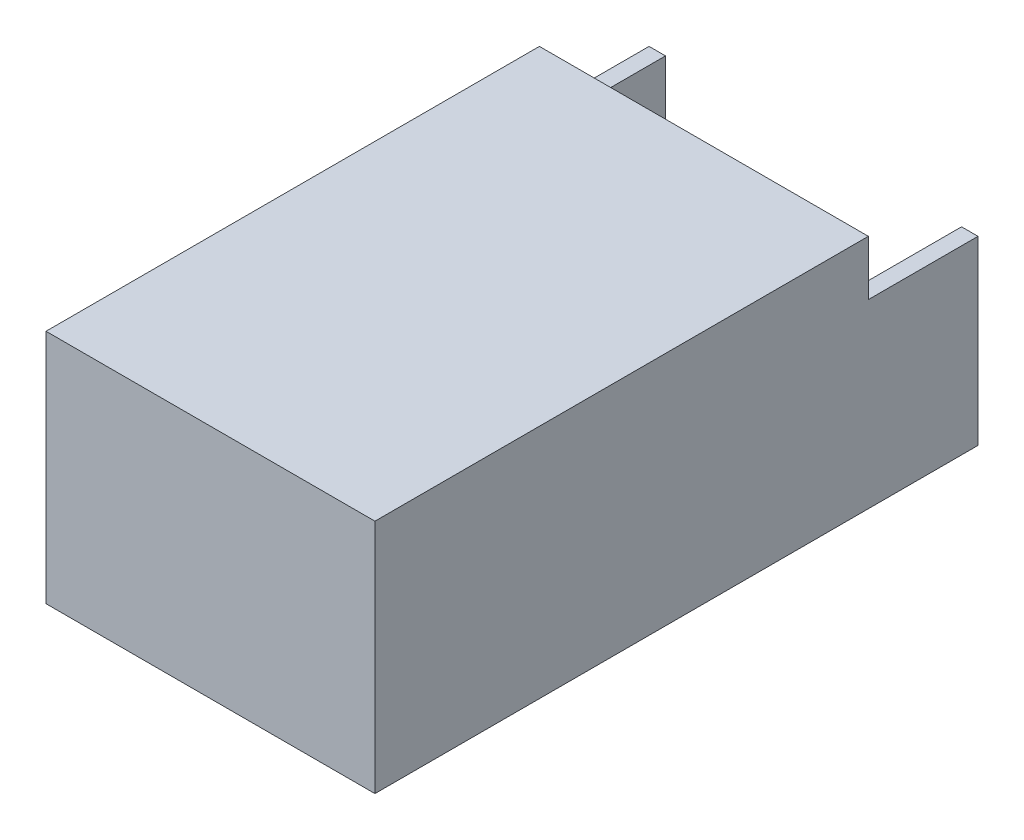
ISO-10303-21;
HEADER;
FILE_DESCRIPTION(('STEP AP214'),'2;1');
FILE_NAME('part.step','',(''),(''),'','','');
FILE_SCHEMA(('AUTOMOTIVE_DESIGN { 1 0 10303 214 1 1 1 1 }'));
ENDSEC;
DATA;
#1=APPLICATION_CONTEXT('core data for automotive mechanical design processes');
#2=APPLICATION_PROTOCOL_DEFINITION('international standard','automotive_design',2000,#1);
#3=PRODUCT_CONTEXT('',#1,'mechanical');
#4=PRODUCT('Part','Part','',(#3));
#5=PRODUCT_RELATED_PRODUCT_CATEGORY('part','',(#4));
#6=PRODUCT_DEFINITION_FORMATION('','',#4);
#7=PRODUCT_DEFINITION_CONTEXT('part definition',#1,'design');
#8=PRODUCT_DEFINITION('design','',#6,#7);
#9=PRODUCT_DEFINITION_SHAPE('','',#8);
#10=(LENGTH_UNIT() NAMED_UNIT(*) SI_UNIT(.MILLI.,.METRE.));
#11=(NAMED_UNIT(*) PLANE_ANGLE_UNIT() SI_UNIT($,.RADIAN.));
#12=(NAMED_UNIT(*) SI_UNIT($,.STERADIAN.) SOLID_ANGLE_UNIT());
#13=UNCERTAINTY_MEASURE_WITH_UNIT(LENGTH_MEASURE(1.E-05),#10,'distance_accuracy_value','');
#14=(GEOMETRIC_REPRESENTATION_CONTEXT(3) GLOBAL_UNCERTAINTY_ASSIGNED_CONTEXT((#13)) GLOBAL_UNIT_ASSIGNED_CONTEXT((#10,
#11,#12)) REPRESENTATION_CONTEXT('',''));
#15=CARTESIAN_POINT('',(0.,0.,0.));
#16=DIRECTION('',(0.,0.,1.));
#17=DIRECTION('',(1.,0.,0.));
#18=AXIS2_PLACEMENT_3D('',#15,#16,#17);
#19=CARTESIAN_POINT('',(3.,3.,110.));
#20=DIRECTION('',(0.,1.,0.));
#21=DIRECTION('',(0.,0.,1.));
#22=AXIS2_PLACEMENT_3D('',#19,#20,#21);
#23=PLANE('',#22);
#24=DIRECTION('',(0.,0.,-1.));
#25=VECTOR('',#24,1.);
#26=CARTESIAN_POINT('',(3.,3.,110.));
#27=LINE('',#26,#25);
#28=CARTESIAN_POINT('',(3.,3.,100.));
#29=VERTEX_POINT('',#28);
#30=CARTESIAN_POINT('',(3.,3.,0.));
#31=VERTEX_POINT('',#30);
#32=EDGE_CURVE('E146',#29,#31,#27,.T.);
#33=ORIENTED_EDGE('',*,*,#32,.F.);
#34=DIRECTION('',(1.,0.,0.));
#35=VECTOR('',#34,1.);
#36=CARTESIAN_POINT('',(3.,3.,100.));
#37=LINE('',#36,#35);
#38=CARTESIAN_POINT('',(57.,3.,100.));
#39=VERTEX_POINT('',#38);
#40=EDGE_CURVE('E55',#29,#39,#37,.T.);
#41=ORIENTED_EDGE('',*,*,#40,.T.);
#42=DIRECTION('',(0.,0.,-1.));
#43=VECTOR('',#42,1.);
#44=CARTESIAN_POINT('',(57.,3.,110.));
#45=LINE('',#44,#43);
#46=CARTESIAN_POINT('',(57.,3.,0.));
#47=VERTEX_POINT('',#46);
#48=EDGE_CURVE('E150',#39,#47,#45,.T.);
#49=ORIENTED_EDGE('',*,*,#48,.T.);
#50=DIRECTION('',(1.,0.,0.));
#51=VECTOR('',#50,1.);
#52=CARTESIAN_POINT('',(3.,3.,0.));
#53=LINE('',#52,#51);
#54=EDGE_CURVE('E245',#31,#47,#53,.T.);
#55=ORIENTED_EDGE('',*,*,#54,.F.);
#56=EDGE_LOOP('',(#33,#41,#49,#55));
#57=FACE_BOUND('',#56,.T.);
#58=ADVANCED_FACE('F39',(#57),#23,.T.);
#59=CARTESIAN_POINT('',(57.,3.,110.));
#60=DIRECTION('',(-1.,0.,0.));
#61=DIRECTION('',(0.,0.,1.));
#62=AXIS2_PLACEMENT_3D('',#59,#60,#61);
#63=PLANE('',#62);
#64=ORIENTED_EDGE('',*,*,#48,.F.);
#65=DIRECTION('',(0.,1.,0.));
#66=VECTOR('',#65,1.);
#67=CARTESIAN_POINT('',(57.,3.,100.));
#68=LINE('',#67,#66);
#69=CARTESIAN_POINT('',(57.,40.037715622259,100.));
#70=VERTEX_POINT('',#69);
#71=EDGE_CURVE('E140',#39,#70,#68,.T.);
#72=ORIENTED_EDGE('',*,*,#71,.T.);
#73=DIRECTION('',(0.,0.,-1.));
#74=VECTOR('',#73,1.);
#75=CARTESIAN_POINT('',(57.,40.037715622259,110.));
#76=LINE('',#75,#74);
#77=CARTESIAN_POINT('',(57.,40.037715622259,20.));
#78=VERTEX_POINT('',#77);
#79=EDGE_CURVE('E138',#70,#78,#76,.T.);
#80=ORIENTED_EDGE('',*,*,#79,.T.);
#81=DIRECTION('',(0.,1.,0.));
#82=VECTOR('',#81,1.);
#83=CARTESIAN_POINT('',(57.,3.,20.));
#84=LINE('',#83,#82);
#85=CARTESIAN_POINT('',(57.,33.0377156222591,20.));
#86=VERTEX_POINT('',#85);
#87=EDGE_CURVE('E242',#86,#78,#84,.T.);
#88=ORIENTED_EDGE('',*,*,#87,.F.);
#89=DIRECTION('',(0.,0.,-1.));
#90=VECTOR('',#89,1.);
#91=CARTESIAN_POINT('',(57.,33.0377156222591,110.));
#92=LINE('',#91,#90);
#93=CARTESIAN_POINT('',(57.,33.0377156222591,0.));
#94=VERTEX_POINT('',#93);
#95=EDGE_CURVE('E234',#86,#94,#92,.T.);
#96=ORIENTED_EDGE('',*,*,#95,.T.);
#97=DIRECTION('',(0.,1.,0.));
#98=VECTOR('',#97,1.);
#99=CARTESIAN_POINT('',(57.,3.,0.));
#100=LINE('',#99,#98);
#101=EDGE_CURVE('E248',#47,#94,#100,.T.);
#102=ORIENTED_EDGE('',*,*,#101,.F.);
#103=EDGE_LOOP('',(#64,#72,#80,#88,#96,#102));
#104=FACE_BOUND('',#103,.T.);
#105=ADVANCED_FACE('F257',(#104),#63,.T.);
#106=CARTESIAN_POINT('',(3.,40.037715622259,110.));
#107=DIRECTION('',(0.,-1.,0.));
#108=DIRECTION('',(0.,0.,-1.));
#109=AXIS2_PLACEMENT_3D('',#106,#107,#108);
#110=PLANE('',#109);
#111=ORIENTED_EDGE('',*,*,#79,.F.);
#112=DIRECTION('',(-1.,0.,0.));
#113=VECTOR('',#112,1.);
#114=CARTESIAN_POINT('',(3.,40.037715622259,100.));
#115=LINE('',#114,#113);
#116=CARTESIAN_POINT('',(3.,40.037715622259,100.));
#117=VERTEX_POINT('',#116);
#118=EDGE_CURVE('E127',#70,#117,#115,.T.);
#119=ORIENTED_EDGE('',*,*,#118,.T.);
#120=DIRECTION('',(0.,0.,-1.));
#121=VECTOR('',#120,1.);
#122=CARTESIAN_POINT('',(3.,40.037715622259,110.));
#123=LINE('',#122,#121);
#124=CARTESIAN_POINT('',(3.,40.037715622259,20.));
#125=VERTEX_POINT('',#124);
#126=EDGE_CURVE('E136',#117,#125,#123,.T.);
#127=ORIENTED_EDGE('',*,*,#126,.T.);
#128=DIRECTION('',(-1.,0.,0.));
#129=VECTOR('',#128,1.);
#130=CARTESIAN_POINT('',(3.00000000000001,40.037715622259,20.));
#131=LINE('',#130,#129);
#132=EDGE_CURVE('E202',#78,#125,#131,.T.);
#133=ORIENTED_EDGE('',*,*,#132,.F.);
#134=EDGE_LOOP('',(#111,#119,#127,#133));
#135=FACE_BOUND('',#134,.T.);
#136=ADVANCED_FACE('F134',(#135),#110,.T.);
#137=CARTESIAN_POINT('',(3.,3.,110.));
#138=DIRECTION('',(1.,0.,0.));
#139=DIRECTION('',(0.,0.,-1.));
#140=AXIS2_PLACEMENT_3D('',#137,#138,#139);
#141=PLANE('',#140);
#142=ORIENTED_EDGE('',*,*,#126,.F.);
#143=DIRECTION('',(0.,-1.,0.));
#144=VECTOR('',#143,1.);
#145=CARTESIAN_POINT('',(3.,3.,100.));
#146=LINE('',#145,#144);
#147=EDGE_CURVE('E11',#117,#29,#146,.T.);
#148=ORIENTED_EDGE('',*,*,#147,.T.);
#149=ORIENTED_EDGE('',*,*,#32,.T.);
#150=DIRECTION('',(0.,-1.,0.));
#151=VECTOR('',#150,1.);
#152=CARTESIAN_POINT('',(3.,3.,0.));
#153=LINE('',#152,#151);
#154=CARTESIAN_POINT('',(3.,33.0377156222591,0.));
#155=VERTEX_POINT('',#154);
#156=EDGE_CURVE('E152',#155,#31,#153,.T.);
#157=ORIENTED_EDGE('',*,*,#156,.F.);
#158=DIRECTION('',(0.,0.,1.));
#159=VECTOR('',#158,1.);
#160=CARTESIAN_POINT('',(3.,33.0377156222591,110.));
#161=LINE('',#160,#159);
#162=CARTESIAN_POINT('',(3.,33.0377156222591,20.));
#163=VERTEX_POINT('',#162);
#164=EDGE_CURVE('E195',#155,#163,#161,.T.);
#165=ORIENTED_EDGE('',*,*,#164,.T.);
#166=DIRECTION('',(0.,-1.,0.));
#167=VECTOR('',#166,1.);
#168=CARTESIAN_POINT('',(3.,3.,20.));
#169=LINE('',#168,#167);
#170=EDGE_CURVE('E48',#125,#163,#169,.T.);
#171=ORIENTED_EDGE('',*,*,#170,.F.);
#172=EDGE_LOOP('',(#142,#148,#149,#157,#165,#171));
#173=FACE_BOUND('',#172,.T.);
#174=ADVANCED_FACE('F143',(#173),#141,.T.);
#175=CARTESIAN_POINT('',(0.,0.,0.));
#176=DIRECTION('',(0.,0.,-1.));
#177=DIRECTION('',(-1.,0.,0.));
#178=AXIS2_PLACEMENT_3D('',#175,#176,#177);
#179=PLANE('',#178);
#180=DIRECTION('',(0.,-1.,0.));
#181=VECTOR('',#180,1.);
#182=CARTESIAN_POINT('',(0.,0.,0.));
#183=LINE('',#182,#181);
#184=CARTESIAN_POINT('',(0.,33.0377156222591,0.));
#185=VERTEX_POINT('',#184);
#186=CARTESIAN_POINT('',(0.,0.,0.));
#187=VERTEX_POINT('',#186);
#188=EDGE_CURVE('E158',#185,#187,#183,.T.);
#189=ORIENTED_EDGE('',*,*,#188,.F.);
#190=DIRECTION('',(-1.,0.,0.));
#191=VECTOR('',#190,1.);
#192=CARTESIAN_POINT('',(0.,33.0377156222591,0.));
#193=LINE('',#192,#191);
#194=EDGE_CURVE('E207',#155,#185,#193,.T.);
#195=ORIENTED_EDGE('',*,*,#194,.F.);
#196=ORIENTED_EDGE('',*,*,#156,.T.);
#197=ORIENTED_EDGE('',*,*,#54,.T.);
#198=ORIENTED_EDGE('',*,*,#101,.T.);
#199=CARTESIAN_POINT('',(60.,33.0377156222591,0.));
#200=VERTEX_POINT('',#199);
#201=EDGE_CURVE('E216',#200,#94,#193,.T.);
#202=ORIENTED_EDGE('',*,*,#201,.F.);
#203=DIRECTION('',(0.,1.,0.));
#204=VECTOR('',#203,1.);
#205=CARTESIAN_POINT('',(60.,0.,0.));
#206=LINE('',#205,#204);
#207=CARTESIAN_POINT('',(60.,0.,0.));
#208=VERTEX_POINT('',#207);
#209=EDGE_CURVE('E164',#208,#200,#206,.T.);
#210=ORIENTED_EDGE('',*,*,#209,.F.);
#211=DIRECTION('',(1.,0.,0.));
#212=VECTOR('',#211,1.);
#213=CARTESIAN_POINT('',(0.,0.,0.));
#214=LINE('',#213,#212);
#215=EDGE_CURVE('E177',#187,#208,#214,.T.);
#216=ORIENTED_EDGE('',*,*,#215,.F.);
#217=EDGE_LOOP('',(#189,#195,#196,#197,#198,#202,#210,#216));
#218=FACE_BOUND('',#217,.T.);
#219=ADVANCED_FACE('F211',(#218),#179,.T.);
#220=CARTESIAN_POINT('',(0.,0.,110.));
#221=DIRECTION('',(0.,0.,-1.));
#222=DIRECTION('',(-1.,0.,0.));
#223=AXIS2_PLACEMENT_3D('',#220,#221,#222);
#224=PLANE('',#223);
#225=DIRECTION('',(0.,-1.,0.));
#226=VECTOR('',#225,1.);
#227=CARTESIAN_POINT('',(0.,0.,110.));
#228=LINE('',#227,#226);
#229=CARTESIAN_POINT('',(0.,43.037715622259,110.));
#230=VERTEX_POINT('',#229);
#231=CARTESIAN_POINT('',(0.,0.,110.));
#232=VERTEX_POINT('',#231);
#233=EDGE_CURVE('E159',#230,#232,#228,.T.);
#234=ORIENTED_EDGE('',*,*,#233,.T.);
#235=DIRECTION('',(1.,0.,0.));
#236=VECTOR('',#235,1.);
#237=CARTESIAN_POINT('',(0.,0.,110.));
#238=LINE('',#237,#236);
#239=CARTESIAN_POINT('',(60.,0.,110.));
#240=VERTEX_POINT('',#239);
#241=EDGE_CURVE('E163',#232,#240,#238,.T.);
#242=ORIENTED_EDGE('',*,*,#241,.T.);
#243=DIRECTION('',(0.,1.,0.));
#244=VECTOR('',#243,1.);
#245=CARTESIAN_POINT('',(60.,0.,110.));
#246=LINE('',#245,#244);
#247=CARTESIAN_POINT('',(60.,43.037715622259,110.));
#248=VERTEX_POINT('',#247);
#249=EDGE_CURVE('E167',#240,#248,#246,.T.);
#250=ORIENTED_EDGE('',*,*,#249,.T.);
#251=DIRECTION('',(-1.,0.,0.));
#252=VECTOR('',#251,1.);
#253=CARTESIAN_POINT('',(0.,43.037715622259,110.));
#254=LINE('',#253,#252);
#255=EDGE_CURVE('E170',#248,#230,#254,.T.);
#256=ORIENTED_EDGE('',*,*,#255,.T.);
#257=EDGE_LOOP('',(#234,#242,#250,#256));
#258=FACE_BOUND('',#257,.T.);
#259=ADVANCED_FACE('F282',(#258),#224,.F.);
#260=CARTESIAN_POINT('',(0.,0.,110.));
#261=DIRECTION('',(1.,0.,0.));
#262=DIRECTION('',(0.,0.,-1.));
#263=AXIS2_PLACEMENT_3D('',#260,#261,#262);
#264=PLANE('',#263);
#265=DIRECTION('',(0.,0.,-1.));
#266=VECTOR('',#265,1.);
#267=CARTESIAN_POINT('',(0.,43.037715622259,110.));
#268=LINE('',#267,#266);
#269=CARTESIAN_POINT('',(0.,43.037715622259,20.));
#270=VERTEX_POINT('',#269);
#271=EDGE_CURVE('E173',#230,#270,#268,.T.);
#272=ORIENTED_EDGE('',*,*,#271,.T.);
#273=DIRECTION('',(0.,1.,0.));
#274=VECTOR('',#273,1.);
#275=CARTESIAN_POINT('',(0.,33.0377156222591,20.));
#276=LINE('',#275,#274);
#277=CARTESIAN_POINT('',(0.,33.0377156222591,20.));
#278=VERTEX_POINT('',#277);
#279=EDGE_CURVE('E221',#278,#270,#276,.T.);
#280=ORIENTED_EDGE('',*,*,#279,.F.);
#281=DIRECTION('',(0.,0.,1.));
#282=VECTOR('',#281,1.);
#283=CARTESIAN_POINT('',(0.,33.0377156222591,0.));
#284=LINE('',#283,#282);
#285=EDGE_CURVE('E229',#185,#278,#284,.T.);
#286=ORIENTED_EDGE('',*,*,#285,.F.);
#287=ORIENTED_EDGE('',*,*,#188,.T.);
#288=DIRECTION('',(0.,0.,-1.));
#289=VECTOR('',#288,1.);
#290=CARTESIAN_POINT('',(0.,0.,110.));
#291=LINE('',#290,#289);
#292=EDGE_CURVE('E192',#232,#187,#291,.T.);
#293=ORIENTED_EDGE('',*,*,#292,.F.);
#294=ORIENTED_EDGE('',*,*,#233,.F.);
#295=EDGE_LOOP('',(#272,#280,#286,#287,#293,#294));
#296=FACE_BOUND('',#295,.T.);
#297=ADVANCED_FACE('F41',(#296),#264,.F.);
#298=CARTESIAN_POINT('',(0.,0.,110.));
#299=DIRECTION('',(0.,1.,0.));
#300=DIRECTION('',(0.,0.,1.));
#301=AXIS2_PLACEMENT_3D('',#298,#299,#300);
#302=PLANE('',#301);
#303=ORIENTED_EDGE('',*,*,#292,.T.);
#304=ORIENTED_EDGE('',*,*,#215,.T.);
#305=DIRECTION('',(0.,0.,-1.));
#306=VECTOR('',#305,1.);
#307=CARTESIAN_POINT('',(60.,0.,110.));
#308=LINE('',#307,#306);
#309=EDGE_CURVE('E189',#240,#208,#308,.T.);
#310=ORIENTED_EDGE('',*,*,#309,.F.);
#311=ORIENTED_EDGE('',*,*,#241,.F.);
#312=EDGE_LOOP('',(#303,#304,#310,#311));
#313=FACE_BOUND('',#312,.T.);
#314=ADVANCED_FACE('F294',(#313),#302,.F.);
#315=CARTESIAN_POINT('',(60.,0.,110.));
#316=DIRECTION('',(-1.,0.,0.));
#317=DIRECTION('',(0.,0.,1.));
#318=AXIS2_PLACEMENT_3D('',#315,#316,#317);
#319=PLANE('',#318);
#320=ORIENTED_EDGE('',*,*,#309,.T.);
#321=ORIENTED_EDGE('',*,*,#209,.T.);
#322=DIRECTION('',(0.,0.,-1.));
#323=VECTOR('',#322,1.);
#324=CARTESIAN_POINT('',(60.,33.0377156222591,0.));
#325=LINE('',#324,#323);
#326=CARTESIAN_POINT('',(60.,33.0377156222591,20.));
#327=VERTEX_POINT('',#326);
#328=EDGE_CURVE('E217',#327,#200,#325,.T.);
#329=ORIENTED_EDGE('',*,*,#328,.F.);
#330=DIRECTION('',(0.,1.,0.));
#331=VECTOR('',#330,1.);
#332=CARTESIAN_POINT('',(60.,33.0377156222591,20.));
#333=LINE('',#332,#331);
#334=CARTESIAN_POINT('',(60.,43.037715622259,20.));
#335=VERTEX_POINT('',#334);
#336=EDGE_CURVE('E230',#327,#335,#333,.T.);
#337=ORIENTED_EDGE('',*,*,#336,.T.);
#338=DIRECTION('',(0.,0.,-1.));
#339=VECTOR('',#338,1.);
#340=CARTESIAN_POINT('',(60.,43.037715622259,110.));
#341=LINE('',#340,#339);
#342=EDGE_CURVE('E186',#248,#335,#341,.T.);
#343=ORIENTED_EDGE('',*,*,#342,.F.);
#344=ORIENTED_EDGE('',*,*,#249,.F.);
#345=EDGE_LOOP('',(#320,#321,#329,#337,#343,#344));
#346=FACE_BOUND('',#345,.T.);
#347=ADVANCED_FACE('F291',(#346),#319,.F.);
#348=CARTESIAN_POINT('',(0.,43.037715622259,110.));
#349=DIRECTION('',(0.,-1.,0.));
#350=DIRECTION('',(0.,0.,-1.));
#351=AXIS2_PLACEMENT_3D('',#348,#349,#350);
#352=PLANE('',#351);
#353=ORIENTED_EDGE('',*,*,#342,.T.);
#354=DIRECTION('',(1.,0.,0.));
#355=VECTOR('',#354,1.);
#356=CARTESIAN_POINT('',(0.,43.037715622259,20.));
#357=LINE('',#356,#355);
#358=EDGE_CURVE('E225',#270,#335,#357,.T.);
#359=ORIENTED_EDGE('',*,*,#358,.F.);
#360=ORIENTED_EDGE('',*,*,#271,.F.);
#361=ORIENTED_EDGE('',*,*,#255,.F.);
#362=EDGE_LOOP('',(#353,#359,#360,#361));
#363=FACE_BOUND('',#362,.T.);
#364=ADVANCED_FACE('F288',(#363),#352,.F.);
#365=CARTESIAN_POINT('',(0.,33.0377156222591,0.));
#366=DIRECTION('',(0.,1.,0.));
#367=DIRECTION('',(0.,0.,1.));
#368=AXIS2_PLACEMENT_3D('',#365,#366,#367);
#369=PLANE('',#368);
#370=DIRECTION('',(1.,0.,0.));
#371=VECTOR('',#370,1.);
#372=CARTESIAN_POINT('',(0.,33.0377156222591,20.));
#373=LINE('',#372,#371);
#374=EDGE_CURVE('E262',#86,#327,#373,.T.);
#375=ORIENTED_EDGE('',*,*,#374,.T.);
#376=ORIENTED_EDGE('',*,*,#328,.T.);
#377=ORIENTED_EDGE('',*,*,#201,.T.);
#378=ORIENTED_EDGE('',*,*,#95,.F.);
#379=EDGE_LOOP('',(#375,#376,#377,#378));
#380=FACE_BOUND('',#379,.T.);
#381=ADVANCED_FACE('F261',(#380),#369,.T.);
#382=CARTESIAN_POINT('',(0.,33.0377156222591,20.));
#383=DIRECTION('',(0.,0.,1.));
#384=DIRECTION('',(1.,0.,0.));
#385=AXIS2_PLACEMENT_3D('',#382,#383,#384);
#386=PLANE('',#385);
#387=ORIENTED_EDGE('',*,*,#87,.T.);
#388=ORIENTED_EDGE('',*,*,#132,.T.);
#389=ORIENTED_EDGE('',*,*,#170,.T.);
#390=EDGE_CURVE('E62',#278,#163,#373,.T.);
#391=ORIENTED_EDGE('',*,*,#390,.F.);
#392=ORIENTED_EDGE('',*,*,#279,.T.);
#393=ORIENTED_EDGE('',*,*,#358,.T.);
#394=ORIENTED_EDGE('',*,*,#336,.F.);
#395=ORIENTED_EDGE('',*,*,#374,.F.);
#396=EDGE_LOOP('',(#387,#388,#389,#391,#392,#393,#394,#395));
#397=FACE_BOUND('',#396,.T.);
#398=ADVANCED_FACE('F200',(#397),#386,.F.);
#399=ORIENTED_EDGE('',*,*,#194,.T.);
#400=ORIENTED_EDGE('',*,*,#285,.T.);
#401=ORIENTED_EDGE('',*,*,#390,.T.);
#402=ORIENTED_EDGE('',*,*,#164,.F.);
#403=EDGE_LOOP('',(#399,#400,#401,#402));
#404=FACE_BOUND('',#403,.T.);
#405=ADVANCED_FACE('F206',(#404),#369,.T.);
#406=CARTESIAN_POINT('',(0.,0.,100.));
#407=DIRECTION('',(0.,0.,1.));
#408=DIRECTION('',(1.,0.,0.));
#409=AXIS2_PLACEMENT_3D('',#406,#407,#408);
#410=PLANE('',#409);
#411=ORIENTED_EDGE('',*,*,#40,.F.);
#412=ORIENTED_EDGE('',*,*,#147,.F.);
#413=ORIENTED_EDGE('',*,*,#118,.F.);
#414=ORIENTED_EDGE('',*,*,#71,.F.);
#415=EDGE_LOOP('',(#411,#412,#413,#414));
#416=FACE_BOUND('',#415,.T.);
#417=ADVANCED_FACE('F126',(#416),#410,.F.);
#418=CLOSED_SHELL('',(#58,#105,#136,#174,#219,#259,#297,#314,#347,#364,#381,#398,#405,#417));
#419=MANIFOLD_SOLID_BREP('B2',#418);
#420=ADVANCED_BREP_SHAPE_REPRESENTATION('',(#18,#419),#14);
#421=SHAPE_DEFINITION_REPRESENTATION(#9,#420);
ENDSEC;
END-ISO-10303-21;
